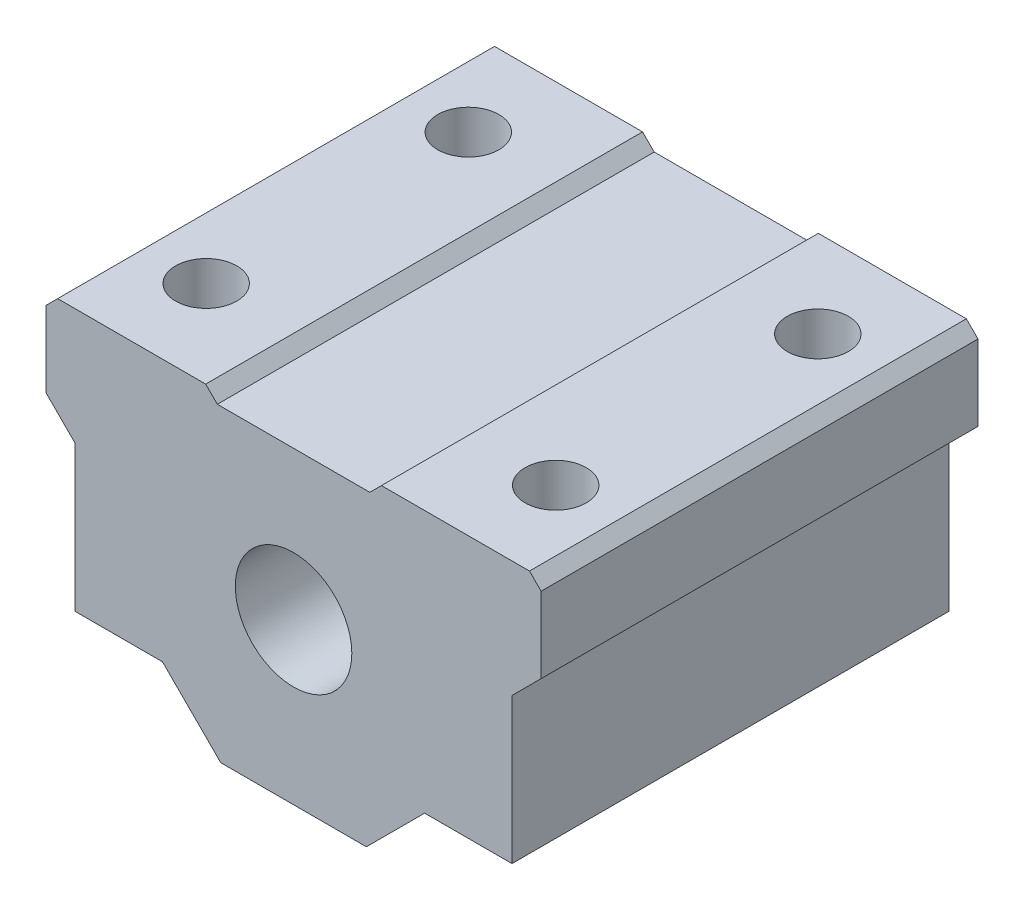
ISO-10303-21;
HEADER;
FILE_DESCRIPTION(('STEP AP214'),'2;1');
FILE_NAME('part.step','',(''),(''),'','','');
FILE_SCHEMA(('AUTOMOTIVE_DESIGN { 1 0 10303 214 1 1 1 1 }'));
ENDSEC;
DATA;
#1=APPLICATION_CONTEXT('core data for automotive mechanical design processes');
#2=APPLICATION_PROTOCOL_DEFINITION('international standard','automotive_design',2000,#1);
#3=PRODUCT_CONTEXT('',#1,'mechanical');
#4=PRODUCT('Part','Part','',(#3));
#5=PRODUCT_RELATED_PRODUCT_CATEGORY('part','',(#4));
#6=PRODUCT_DEFINITION_FORMATION('','',#4);
#7=PRODUCT_DEFINITION_CONTEXT('part definition',#1,'design');
#8=PRODUCT_DEFINITION('design','',#6,#7);
#9=PRODUCT_DEFINITION_SHAPE('','',#8);
#10=(LENGTH_UNIT() NAMED_UNIT(*) SI_UNIT(.MILLI.,.METRE.));
#11=(NAMED_UNIT(*) PLANE_ANGLE_UNIT() SI_UNIT($,.RADIAN.));
#12=(NAMED_UNIT(*) SI_UNIT($,.STERADIAN.) SOLID_ANGLE_UNIT());
#13=UNCERTAINTY_MEASURE_WITH_UNIT(LENGTH_MEASURE(1.E-05),#10,'distance_accuracy_value','');
#14=(GEOMETRIC_REPRESENTATION_CONTEXT(3) GLOBAL_UNCERTAINTY_ASSIGNED_CONTEXT((#13)) GLOBAL_UNIT_ASSIGNED_CONTEXT((#10,
#11,#12)) REPRESENTATION_CONTEXT('',''));
#15=CARTESIAN_POINT('',(0.,0.,0.));
#16=DIRECTION('',(0.,0.,1.));
#17=DIRECTION('',(1.,0.,0.));
#18=AXIS2_PLACEMENT_3D('',#15,#16,#17);
#19=CARTESIAN_POINT('',(0.,0.,30.));
#20=DIRECTION('',(0.,0.,-1.));
#21=DIRECTION('',(-1.,0.,0.));
#22=AXIS2_PLACEMENT_3D('',#19,#20,#21);
#23=PLANE('',#22);
#24=DIRECTION('',(0.707106781186546,-0.707106781186549,0.));
#25=VECTOR('',#24,1.);
#26=CARTESIAN_POINT('',(-5.,-11.,30.));
#27=LINE('',#26,#25);
#28=CARTESIAN_POINT('',(-8.99999999999998,-7.,30.));
#29=VERTEX_POINT('',#28);
#30=CARTESIAN_POINT('',(-5.,-11.,30.));
#31=VERTEX_POINT('',#30);
#32=EDGE_CURVE('E229',#29,#31,#27,.T.);
#33=ORIENTED_EDGE('',*,*,#32,.T.);
#34=DIRECTION('',(1.,0.,0.));
#35=VECTOR('',#34,1.);
#36=CARTESIAN_POINT('',(5.,-11.,30.));
#37=LINE('',#36,#35);
#38=CARTESIAN_POINT('',(5.,-11.,30.));
#39=VERTEX_POINT('',#38);
#40=EDGE_CURVE('E127',#31,#39,#37,.T.);
#41=ORIENTED_EDGE('',*,*,#40,.T.);
#42=DIRECTION('',(0.707106781186546,0.707106781186549,0.));
#43=VECTOR('',#42,1.);
#44=CARTESIAN_POINT('',(5.,-11.,30.));
#45=LINE('',#44,#43);
#46=CARTESIAN_POINT('',(8.99999999999999,-7.,30.));
#47=VERTEX_POINT('',#46);
#48=EDGE_CURVE('E299',#39,#47,#45,.T.);
#49=ORIENTED_EDGE('',*,*,#48,.T.);
#50=DIRECTION('',(1.,0.,0.));
#51=VECTOR('',#50,1.);
#52=CARTESIAN_POINT('',(8.99999999999999,-7.,30.));
#53=LINE('',#52,#51);
#54=CARTESIAN_POINT('',(15.,-7.,30.));
#55=VERTEX_POINT('',#54);
#56=EDGE_CURVE('E301',#47,#55,#53,.T.);
#57=ORIENTED_EDGE('',*,*,#56,.T.);
#58=DIRECTION('',(0.,1.,0.));
#59=VECTOR('',#58,1.);
#60=CARTESIAN_POINT('',(15.,-7.,30.));
#61=LINE('',#60,#59);
#62=CARTESIAN_POINT('',(15.,3.00000000000001,30.));
#63=VERTEX_POINT('',#62);
#64=EDGE_CURVE('E303',#55,#63,#61,.T.);
#65=ORIENTED_EDGE('',*,*,#64,.T.);
#66=DIRECTION('',(0.707106781186548,0.707106781186547,0.));
#67=VECTOR('',#66,1.);
#68=CARTESIAN_POINT('',(15.,3.00000000000001,30.));
#69=LINE('',#68,#67);
#70=CARTESIAN_POINT('',(17.,5.,30.));
#71=VERTEX_POINT('',#70);
#72=EDGE_CURVE('E305',#63,#71,#69,.T.);
#73=ORIENTED_EDGE('',*,*,#72,.T.);
#74=DIRECTION('',(0.,1.,0.));
#75=VECTOR('',#74,1.);
#76=CARTESIAN_POINT('',(17.,5.,30.));
#77=LINE('',#76,#75);
#78=CARTESIAN_POINT('',(17.,10.2,30.));
#79=VERTEX_POINT('',#78);
#80=EDGE_CURVE('E307',#71,#79,#77,.T.);
#81=ORIENTED_EDGE('',*,*,#80,.T.);
#82=DIRECTION('',(-0.707106781186545,0.70710678118655,0.));
#83=VECTOR('',#82,1.);
#84=CARTESIAN_POINT('',(17.,10.2,30.));
#85=LINE('',#84,#83);
#86=CARTESIAN_POINT('',(16.2,11.,30.));
#87=VERTEX_POINT('',#86);
#88=EDGE_CURVE('E309',#79,#87,#85,.T.);
#89=ORIENTED_EDGE('',*,*,#88,.T.);
#90=DIRECTION('',(-1.,0.,0.));
#91=VECTOR('',#90,1.);
#92=CARTESIAN_POINT('',(16.2,11.,30.));
#93=LINE('',#92,#91);
#94=CARTESIAN_POINT('',(6.03499910675989,11.,30.));
#95=VERTEX_POINT('',#94);
#96=EDGE_CURVE('E311',#87,#95,#93,.T.);
#97=ORIENTED_EDGE('',*,*,#96,.T.);
#98=DIRECTION('',(-0.707106781186546,-0.707106781186549,0.));
#99=VECTOR('',#98,1.);
#100=CARTESIAN_POINT('',(6.03499910675989,11.,30.));
#101=LINE('',#100,#99);
#102=CARTESIAN_POINT('',(5.23499910675989,10.2,30.));
#103=VERTEX_POINT('',#102);
#104=EDGE_CURVE('E313',#95,#103,#101,.T.);
#105=ORIENTED_EDGE('',*,*,#104,.T.);
#106=DIRECTION('',(-1.,0.,0.));
#107=VECTOR('',#106,1.);
#108=CARTESIAN_POINT('',(-5.23499910675989,10.2,30.));
#109=LINE('',#108,#107);
#110=CARTESIAN_POINT('',(-5.23499910675989,10.2,30.));
#111=VERTEX_POINT('',#110);
#112=EDGE_CURVE('E315',#103,#111,#109,.T.);
#113=ORIENTED_EDGE('',*,*,#112,.T.);
#114=DIRECTION('',(-0.707106781186546,0.707106781186549,0.));
#115=VECTOR('',#114,1.);
#116=CARTESIAN_POINT('',(-6.03499910675989,11.,30.));
#117=LINE('',#116,#115);
#118=CARTESIAN_POINT('',(-6.03499910675989,11.,30.));
#119=VERTEX_POINT('',#118);
#120=EDGE_CURVE('E317',#111,#119,#117,.T.);
#121=ORIENTED_EDGE('',*,*,#120,.T.);
#122=DIRECTION('',(-1.,0.,0.));
#123=VECTOR('',#122,1.);
#124=CARTESIAN_POINT('',(-16.2,11.,30.));
#125=LINE('',#124,#123);
#126=CARTESIAN_POINT('',(-16.2,11.,30.));
#127=VERTEX_POINT('',#126);
#128=EDGE_CURVE('E319',#119,#127,#125,.T.);
#129=ORIENTED_EDGE('',*,*,#128,.T.);
#130=DIRECTION('',(-0.707106781186547,-0.707106781186548,0.));
#131=VECTOR('',#130,1.);
#132=CARTESIAN_POINT('',(-17.,10.2,30.));
#133=LINE('',#132,#131);
#134=CARTESIAN_POINT('',(-17.,10.2,30.));
#135=VERTEX_POINT('',#134);
#136=EDGE_CURVE('E321',#127,#135,#133,.T.);
#137=ORIENTED_EDGE('',*,*,#136,.T.);
#138=DIRECTION('',(0.,-1.,0.));
#139=VECTOR('',#138,1.);
#140=CARTESIAN_POINT('',(-17.,5.,30.));
#141=LINE('',#140,#139);
#142=CARTESIAN_POINT('',(-17.,5.,30.));
#143=VERTEX_POINT('',#142);
#144=EDGE_CURVE('E176',#135,#143,#141,.T.);
#145=ORIENTED_EDGE('',*,*,#144,.T.);
#146=DIRECTION('',(0.707106781186549,-0.707106781186546,0.));
#147=VECTOR('',#146,1.);
#148=CARTESIAN_POINT('',(-15.,3.00000000000001,30.));
#149=LINE('',#148,#147);
#150=CARTESIAN_POINT('',(-15.,3.00000000000001,30.));
#151=VERTEX_POINT('',#150);
#152=EDGE_CURVE('E170',#143,#151,#149,.T.);
#153=ORIENTED_EDGE('',*,*,#152,.T.);
#154=DIRECTION('',(0.,-1.,0.));
#155=VECTOR('',#154,1.);
#156=CARTESIAN_POINT('',(-15.,-7.,30.));
#157=LINE('',#156,#155);
#158=CARTESIAN_POINT('',(-15.,-7.,30.));
#159=VERTEX_POINT('',#158);
#160=EDGE_CURVE('E174',#151,#159,#157,.T.);
#161=ORIENTED_EDGE('',*,*,#160,.T.);
#162=DIRECTION('',(1.,0.,0.));
#163=VECTOR('',#162,1.);
#164=CARTESIAN_POINT('',(-8.99999999999998,-7.,30.));
#165=LINE('',#164,#163);
#166=EDGE_CURVE('E54',#159,#29,#165,.T.);
#167=ORIENTED_EDGE('',*,*,#166,.T.);
#168=EDGE_LOOP('',(#33,#41,#49,#57,#65,#73,#81,#89,#97,#105,#113,#121,#129,#137,#145,#153,#161,#167));
#169=FACE_BOUND('',#168,.T.);
#170=CARTESIAN_POINT('',(0.,0.,30.));
#171=DIRECTION('',(0.,0.,1.));
#172=DIRECTION('',(1.,0.,0.));
#173=AXIS2_PLACEMENT_3D('',#170,#171,#172);
#174=CIRCLE('',#173,4.);
#175=CARTESIAN_POINT('',(4.,0.,30.));
#176=VERTEX_POINT('',#175);
#177=EDGE_CURVE('E198',#176,#176,#174,.T.);
#178=ORIENTED_EDGE('',*,*,#177,.F.);
#179=EDGE_LOOP('',(#178));
#180=FACE_BOUND('',#179,.T.);
#181=ADVANCED_FACE('F35',(#169,#180),#23,.F.);
#182=CARTESIAN_POINT('',(0.,0.,0.));
#183=DIRECTION('',(0.,0.,-1.));
#184=DIRECTION('',(-1.,0.,0.));
#185=AXIS2_PLACEMENT_3D('',#182,#183,#184);
#186=PLANE('',#185);
#187=DIRECTION('',(0.707106781186546,-0.707106781186549,0.));
#188=VECTOR('',#187,1.);
#189=CARTESIAN_POINT('',(-5.,-11.,0.));
#190=LINE('',#189,#188);
#191=CARTESIAN_POINT('',(-8.99999999999998,-7.,0.));
#192=VERTEX_POINT('',#191);
#193=CARTESIAN_POINT('',(-5.,-11.,0.));
#194=VERTEX_POINT('',#193);
#195=EDGE_CURVE('E194',#192,#194,#190,.T.);
#196=ORIENTED_EDGE('',*,*,#195,.F.);
#197=DIRECTION('',(1.,0.,0.));
#198=VECTOR('',#197,1.);
#199=CARTESIAN_POINT('',(-8.99999999999998,-7.,0.));
#200=LINE('',#199,#198);
#201=CARTESIAN_POINT('',(-15.,-7.,0.));
#202=VERTEX_POINT('',#201);
#203=EDGE_CURVE('E119',#202,#192,#200,.T.);
#204=ORIENTED_EDGE('',*,*,#203,.F.);
#205=DIRECTION('',(0.,-1.,0.));
#206=VECTOR('',#205,1.);
#207=CARTESIAN_POINT('',(-15.,-7.,0.));
#208=LINE('',#207,#206);
#209=CARTESIAN_POINT('',(-15.,3.00000000000001,0.));
#210=VERTEX_POINT('',#209);
#211=EDGE_CURVE('E113',#210,#202,#208,.T.);
#212=ORIENTED_EDGE('',*,*,#211,.F.);
#213=DIRECTION('',(0.707106781186549,-0.707106781186546,0.));
#214=VECTOR('',#213,1.);
#215=CARTESIAN_POINT('',(-15.,3.00000000000001,0.));
#216=LINE('',#215,#214);
#217=CARTESIAN_POINT('',(-17.,5.,0.));
#218=VERTEX_POINT('',#217);
#219=EDGE_CURVE('E184',#218,#210,#216,.T.);
#220=ORIENTED_EDGE('',*,*,#219,.F.);
#221=DIRECTION('',(0.,-1.,0.));
#222=VECTOR('',#221,1.);
#223=CARTESIAN_POINT('',(-17.,5.,0.));
#224=LINE('',#223,#222);
#225=CARTESIAN_POINT('',(-17.,10.2,0.));
#226=VERTEX_POINT('',#225);
#227=EDGE_CURVE('E224',#226,#218,#224,.T.);
#228=ORIENTED_EDGE('',*,*,#227,.F.);
#229=DIRECTION('',(-0.707106781186547,-0.707106781186548,0.));
#230=VECTOR('',#229,1.);
#231=CARTESIAN_POINT('',(-17.,10.2,0.));
#232=LINE('',#231,#230);
#233=CARTESIAN_POINT('',(-16.2,11.,0.));
#234=VERTEX_POINT('',#233);
#235=EDGE_CURVE('E222',#234,#226,#232,.T.);
#236=ORIENTED_EDGE('',*,*,#235,.F.);
#237=DIRECTION('',(-1.,0.,0.));
#238=VECTOR('',#237,1.);
#239=CARTESIAN_POINT('',(-16.2,11.,0.));
#240=LINE('',#239,#238);
#241=CARTESIAN_POINT('',(-6.03499910675989,11.,0.));
#242=VERTEX_POINT('',#241);
#243=EDGE_CURVE('E220',#242,#234,#240,.T.);
#244=ORIENTED_EDGE('',*,*,#243,.F.);
#245=DIRECTION('',(-0.707106781186546,0.707106781186549,0.));
#246=VECTOR('',#245,1.);
#247=CARTESIAN_POINT('',(-6.03499910675989,11.,0.));
#248=LINE('',#247,#246);
#249=CARTESIAN_POINT('',(-5.23499910675989,10.2,0.));
#250=VERTEX_POINT('',#249);
#251=EDGE_CURVE('E218',#250,#242,#248,.T.);
#252=ORIENTED_EDGE('',*,*,#251,.F.);
#253=DIRECTION('',(-1.,0.,0.));
#254=VECTOR('',#253,1.);
#255=CARTESIAN_POINT('',(-5.23499910675989,10.2,0.));
#256=LINE('',#255,#254);
#257=CARTESIAN_POINT('',(5.23499910675989,10.2,0.));
#258=VERTEX_POINT('',#257);
#259=EDGE_CURVE('E216',#258,#250,#256,.T.);
#260=ORIENTED_EDGE('',*,*,#259,.F.);
#261=DIRECTION('',(-0.707106781186546,-0.707106781186549,0.));
#262=VECTOR('',#261,1.);
#263=CARTESIAN_POINT('',(6.03499910675989,11.,0.));
#264=LINE('',#263,#262);
#265=CARTESIAN_POINT('',(6.03499910675989,11.,0.));
#266=VERTEX_POINT('',#265);
#267=EDGE_CURVE('E214',#266,#258,#264,.T.);
#268=ORIENTED_EDGE('',*,*,#267,.F.);
#269=DIRECTION('',(-1.,0.,0.));
#270=VECTOR('',#269,1.);
#271=CARTESIAN_POINT('',(16.2,11.,0.));
#272=LINE('',#271,#270);
#273=CARTESIAN_POINT('',(16.2,11.,0.));
#274=VERTEX_POINT('',#273);
#275=EDGE_CURVE('E212',#274,#266,#272,.T.);
#276=ORIENTED_EDGE('',*,*,#275,.F.);
#277=DIRECTION('',(-0.707106781186545,0.70710678118655,0.));
#278=VECTOR('',#277,1.);
#279=CARTESIAN_POINT('',(17.,10.2,0.));
#280=LINE('',#279,#278);
#281=CARTESIAN_POINT('',(17.,10.2,0.));
#282=VERTEX_POINT('',#281);
#283=EDGE_CURVE('E210',#282,#274,#280,.T.);
#284=ORIENTED_EDGE('',*,*,#283,.F.);
#285=DIRECTION('',(0.,1.,0.));
#286=VECTOR('',#285,1.);
#287=CARTESIAN_POINT('',(17.,5.,0.));
#288=LINE('',#287,#286);
#289=CARTESIAN_POINT('',(17.,5.,0.));
#290=VERTEX_POINT('',#289);
#291=EDGE_CURVE('E208',#290,#282,#288,.T.);
#292=ORIENTED_EDGE('',*,*,#291,.F.);
#293=DIRECTION('',(0.707106781186548,0.707106781186547,0.));
#294=VECTOR('',#293,1.);
#295=CARTESIAN_POINT('',(15.,3.00000000000001,0.));
#296=LINE('',#295,#294);
#297=CARTESIAN_POINT('',(15.,3.00000000000001,0.));
#298=VERTEX_POINT('',#297);
#299=EDGE_CURVE('E206',#298,#290,#296,.T.);
#300=ORIENTED_EDGE('',*,*,#299,.F.);
#301=DIRECTION('',(0.,1.,0.));
#302=VECTOR('',#301,1.);
#303=CARTESIAN_POINT('',(15.,-7.,0.));
#304=LINE('',#303,#302);
#305=CARTESIAN_POINT('',(15.,-7.,0.));
#306=VERTEX_POINT('',#305);
#307=EDGE_CURVE('E204',#306,#298,#304,.T.);
#308=ORIENTED_EDGE('',*,*,#307,.F.);
#309=DIRECTION('',(1.,0.,0.));
#310=VECTOR('',#309,1.);
#311=CARTESIAN_POINT('',(8.99999999999999,-7.,0.));
#312=LINE('',#311,#310);
#313=CARTESIAN_POINT('',(8.99999999999999,-7.,0.));
#314=VERTEX_POINT('',#313);
#315=EDGE_CURVE('E202',#314,#306,#312,.T.);
#316=ORIENTED_EDGE('',*,*,#315,.F.);
#317=DIRECTION('',(0.707106781186546,0.707106781186549,0.));
#318=VECTOR('',#317,1.);
#319=CARTESIAN_POINT('',(5.,-11.,0.));
#320=LINE('',#319,#318);
#321=CARTESIAN_POINT('',(5.,-11.,0.));
#322=VERTEX_POINT('',#321);
#323=EDGE_CURVE('E200',#322,#314,#320,.T.);
#324=ORIENTED_EDGE('',*,*,#323,.F.);
#325=DIRECTION('',(1.,0.,0.));
#326=VECTOR('',#325,1.);
#327=CARTESIAN_POINT('',(5.,-11.,0.));
#328=LINE('',#327,#326);
#329=EDGE_CURVE('E197',#194,#322,#328,.T.);
#330=ORIENTED_EDGE('',*,*,#329,.F.);
#331=EDGE_LOOP('',(#196,#204,#212,#220,#228,#236,#244,#252,#260,#268,#276,#284,#292,#300,#308,
#316,#324,#330));
#332=FACE_BOUND('',#331,.T.);
#333=CARTESIAN_POINT('',(0.,0.,0.));
#334=DIRECTION('',(0.,0.,1.));
#335=DIRECTION('',(1.,0.,0.));
#336=AXIS2_PLACEMENT_3D('',#333,#334,#335);
#337=CIRCLE('',#336,4.);
#338=CARTESIAN_POINT('',(4.,0.,0.));
#339=VERTEX_POINT('',#338);
#340=EDGE_CURVE('E292',#339,#339,#337,.T.);
#341=ORIENTED_EDGE('',*,*,#340,.T.);
#342=EDGE_LOOP('',(#341));
#343=FACE_BOUND('',#342,.T.);
#344=ADVANCED_FACE('F334',(#332,#343),#186,.T.);
#345=CARTESIAN_POINT('',(-5.,-11.,30.));
#346=DIRECTION('',(0.707106781186549,0.707106781186546,0.));
#347=DIRECTION('',(-0.707106781186546,0.707106781186549,0.));
#348=AXIS2_PLACEMENT_3D('',#345,#346,#347);
#349=PLANE('',#348);
#350=ORIENTED_EDGE('',*,*,#195,.T.);
#351=DIRECTION('',(0.,0.,-1.));
#352=VECTOR('',#351,1.);
#353=CARTESIAN_POINT('',(-5.,-11.,30.));
#354=LINE('',#353,#352);
#355=EDGE_CURVE('E11',#31,#194,#354,.T.);
#356=ORIENTED_EDGE('',*,*,#355,.F.);
#357=ORIENTED_EDGE('',*,*,#32,.F.);
#358=DIRECTION('',(0.,0.,-1.));
#359=VECTOR('',#358,1.);
#360=CARTESIAN_POINT('',(-8.99999999999998,-7.,30.));
#361=LINE('',#360,#359);
#362=EDGE_CURVE('E190',#29,#192,#361,.T.);
#363=ORIENTED_EDGE('',*,*,#362,.T.);
#364=EDGE_LOOP('',(#350,#356,#357,#363));
#365=FACE_BOUND('',#364,.T.);
#366=ADVANCED_FACE('F37',(#365),#349,.F.);
#367=CARTESIAN_POINT('',(5.,-11.,30.));
#368=DIRECTION('',(0.,1.,0.));
#369=DIRECTION('',(-1.,0.,0.));
#370=AXIS2_PLACEMENT_3D('',#367,#368,#369);
#371=PLANE('',#370);
#372=ORIENTED_EDGE('',*,*,#329,.T.);
#373=DIRECTION('',(0.,0.,-1.));
#374=VECTOR('',#373,1.);
#375=CARTESIAN_POINT('',(5.,-11.,30.));
#376=LINE('',#375,#374);
#377=EDGE_CURVE('E45',#39,#322,#376,.T.);
#378=ORIENTED_EDGE('',*,*,#377,.F.);
#379=ORIENTED_EDGE('',*,*,#40,.F.);
#380=ORIENTED_EDGE('',*,*,#355,.T.);
#381=EDGE_LOOP('',(#372,#378,#379,#380));
#382=FACE_BOUND('',#381,.T.);
#383=ADVANCED_FACE('F411',(#382),#371,.F.);
#384=CARTESIAN_POINT('',(5.,-11.,30.));
#385=DIRECTION('',(-0.707106781186549,0.707106781186546,0.));
#386=DIRECTION('',(-0.707106781186546,-0.707106781186549,0.));
#387=AXIS2_PLACEMENT_3D('',#384,#385,#386);
#388=PLANE('',#387);
#389=ORIENTED_EDGE('',*,*,#323,.T.);
#390=DIRECTION('',(0.,0.,-1.));
#391=VECTOR('',#390,1.);
#392=CARTESIAN_POINT('',(8.99999999999999,-7.,30.));
#393=LINE('',#392,#391);
#394=EDGE_CURVE('E266',#47,#314,#393,.T.);
#395=ORIENTED_EDGE('',*,*,#394,.F.);
#396=ORIENTED_EDGE('',*,*,#48,.F.);
#397=ORIENTED_EDGE('',*,*,#377,.T.);
#398=EDGE_LOOP('',(#389,#395,#396,#397));
#399=FACE_BOUND('',#398,.T.);
#400=ADVANCED_FACE('F385',(#399),#388,.F.);
#401=CARTESIAN_POINT('',(8.99999999999999,-7.,30.));
#402=DIRECTION('',(0.,1.,0.));
#403=DIRECTION('',(-1.,0.,0.));
#404=AXIS2_PLACEMENT_3D('',#401,#402,#403);
#405=PLANE('',#404);
#406=CARTESIAN_POINT('',(12.,-7.,6.));
#407=DIRECTION('',(0.,1.,0.));
#408=DIRECTION('',(-1.,0.,0.));
#409=AXIS2_PLACEMENT_3D('',#406,#407,#408);
#410=CIRCLE('',#409,2.1);
#411=CARTESIAN_POINT('',(9.9,-7.,6.));
#412=VERTEX_POINT('',#411);
#413=EDGE_CURVE('E289',#412,#412,#410,.T.);
#414=ORIENTED_EDGE('',*,*,#413,.T.);
#415=EDGE_LOOP('',(#414));
#416=FACE_BOUND('',#415,.T.);
#417=CARTESIAN_POINT('',(12.,-7.,24.));
#418=DIRECTION('',(0.,1.,0.));
#419=DIRECTION('',(-1.,0.,0.));
#420=AXIS2_PLACEMENT_3D('',#417,#418,#419);
#421=CIRCLE('',#420,2.1);
#422=CARTESIAN_POINT('',(9.9,-7.,24.));
#423=VERTEX_POINT('',#422);
#424=EDGE_CURVE('E276',#423,#423,#421,.T.);
#425=ORIENTED_EDGE('',*,*,#424,.T.);
#426=EDGE_LOOP('',(#425));
#427=FACE_BOUND('',#426,.T.);
#428=ORIENTED_EDGE('',*,*,#315,.T.);
#429=DIRECTION('',(0.,0.,-1.));
#430=VECTOR('',#429,1.);
#431=CARTESIAN_POINT('',(15.,-7.,30.));
#432=LINE('',#431,#430);
#433=EDGE_CURVE('E263',#55,#306,#432,.T.);
#434=ORIENTED_EDGE('',*,*,#433,.F.);
#435=ORIENTED_EDGE('',*,*,#56,.F.);
#436=ORIENTED_EDGE('',*,*,#394,.T.);
#437=EDGE_LOOP('',(#428,#434,#435,#436));
#438=FACE_BOUND('',#437,.T.);
#439=ADVANCED_FACE('F381',(#416,#427,#438),#405,.F.);
#440=CARTESIAN_POINT('',(15.,-7.,30.));
#441=DIRECTION('',(-1.,0.,0.));
#442=DIRECTION('',(0.,-1.,0.));
#443=AXIS2_PLACEMENT_3D('',#440,#441,#442);
#444=PLANE('',#443);
#445=ORIENTED_EDGE('',*,*,#307,.T.);
#446=DIRECTION('',(0.,0.,-1.));
#447=VECTOR('',#446,1.);
#448=CARTESIAN_POINT('',(15.,3.00000000000001,30.));
#449=LINE('',#448,#447);
#450=EDGE_CURVE('E260',#63,#298,#449,.T.);
#451=ORIENTED_EDGE('',*,*,#450,.F.);
#452=ORIENTED_EDGE('',*,*,#64,.F.);
#453=ORIENTED_EDGE('',*,*,#433,.T.);
#454=EDGE_LOOP('',(#445,#451,#452,#453));
#455=FACE_BOUND('',#454,.T.);
#456=ADVANCED_FACE('F384',(#455),#444,.F.);
#457=CARTESIAN_POINT('',(15.,3.00000000000001,30.));
#458=DIRECTION('',(-0.707106781186547,0.707106781186548,0.));
#459=DIRECTION('',(-0.707106781186548,-0.707106781186547,0.));
#460=AXIS2_PLACEMENT_3D('',#457,#458,#459);
#461=PLANE('',#460);
#462=ORIENTED_EDGE('',*,*,#299,.T.);
#463=DIRECTION('',(0.,0.,-1.));
#464=VECTOR('',#463,1.);
#465=CARTESIAN_POINT('',(17.,5.,30.));
#466=LINE('',#465,#464);
#467=EDGE_CURVE('E257',#71,#290,#466,.T.);
#468=ORIENTED_EDGE('',*,*,#467,.F.);
#469=ORIENTED_EDGE('',*,*,#72,.F.);
#470=ORIENTED_EDGE('',*,*,#450,.T.);
#471=EDGE_LOOP('',(#462,#468,#469,#470));
#472=FACE_BOUND('',#471,.T.);
#473=ADVANCED_FACE('F401',(#472),#461,.F.);
#474=CARTESIAN_POINT('',(17.,5.,30.));
#475=DIRECTION('',(-1.,0.,0.));
#476=DIRECTION('',(0.,0.,1.));
#477=AXIS2_PLACEMENT_3D('',#474,#475,#476);
#478=PLANE('',#477);
#479=ORIENTED_EDGE('',*,*,#291,.T.);
#480=DIRECTION('',(0.,0.,-1.));
#481=VECTOR('',#480,1.);
#482=CARTESIAN_POINT('',(17.,10.2,30.));
#483=LINE('',#482,#481);
#484=EDGE_CURVE('E254',#79,#282,#483,.T.);
#485=ORIENTED_EDGE('',*,*,#484,.F.);
#486=ORIENTED_EDGE('',*,*,#80,.F.);
#487=ORIENTED_EDGE('',*,*,#467,.T.);
#488=EDGE_LOOP('',(#479,#485,#486,#487));
#489=FACE_BOUND('',#488,.T.);
#490=ADVANCED_FACE('F405',(#489),#478,.F.);
#491=CARTESIAN_POINT('',(17.,10.2,30.));
#492=DIRECTION('',(-0.70710678118655,-0.707106781186545,0.));
#493=DIRECTION('',(0.707106781186545,-0.70710678118655,0.));
#494=AXIS2_PLACEMENT_3D('',#491,#492,#493);
#495=PLANE('',#494);
#496=ORIENTED_EDGE('',*,*,#283,.T.);
#497=DIRECTION('',(0.,0.,-1.));
#498=VECTOR('',#497,1.);
#499=CARTESIAN_POINT('',(16.2,11.,30.));
#500=LINE('',#499,#498);
#501=EDGE_CURVE('E251',#87,#274,#500,.T.);
#502=ORIENTED_EDGE('',*,*,#501,.F.);
#503=ORIENTED_EDGE('',*,*,#88,.F.);
#504=ORIENTED_EDGE('',*,*,#484,.T.);
#505=EDGE_LOOP('',(#496,#502,#503,#504));
#506=FACE_BOUND('',#505,.T.);
#507=ADVANCED_FACE('F425',(#506),#495,.F.);
#508=CARTESIAN_POINT('',(16.2,11.,30.));
#509=DIRECTION('',(0.,-1.,0.));
#510=DIRECTION('',(1.,0.,0.));
#511=AXIS2_PLACEMENT_3D('',#508,#509,#510);
#512=PLANE('',#511);
#513=CARTESIAN_POINT('',(12.,11.,6.));
#514=DIRECTION('',(0.,1.,0.));
#515=DIRECTION('',(0.,0.,-1.));
#516=AXIS2_PLACEMENT_3D('',#513,#514,#515);
#517=CIRCLE('',#516,2.1);
#518=CARTESIAN_POINT('',(12.,11.,3.9));
#519=VERTEX_POINT('',#518);
#520=EDGE_CURVE('E283',#519,#519,#517,.T.);
#521=ORIENTED_EDGE('',*,*,#520,.F.);
#522=EDGE_LOOP('',(#521));
#523=FACE_BOUND('',#522,.T.);
#524=CARTESIAN_POINT('',(12.,11.,24.));
#525=DIRECTION('',(0.,1.,0.));
#526=DIRECTION('',(0.,0.,-1.));
#527=AXIS2_PLACEMENT_3D('',#524,#525,#526);
#528=CIRCLE('',#527,2.1);
#529=CARTESIAN_POINT('',(12.,11.,21.9));
#530=VERTEX_POINT('',#529);
#531=EDGE_CURVE('E378',#530,#530,#528,.T.);
#532=ORIENTED_EDGE('',*,*,#531,.F.);
#533=EDGE_LOOP('',(#532));
#534=FACE_BOUND('',#533,.T.);
#535=ORIENTED_EDGE('',*,*,#275,.T.);
#536=DIRECTION('',(0.,0.,-1.));
#537=VECTOR('',#536,1.);
#538=CARTESIAN_POINT('',(6.03499910675989,11.,30.));
#539=LINE('',#538,#537);
#540=EDGE_CURVE('E248',#95,#266,#539,.T.);
#541=ORIENTED_EDGE('',*,*,#540,.F.);
#542=ORIENTED_EDGE('',*,*,#96,.F.);
#543=ORIENTED_EDGE('',*,*,#501,.T.);
#544=EDGE_LOOP('',(#535,#541,#542,#543));
#545=FACE_BOUND('',#544,.T.);
#546=ADVANCED_FACE('F428',(#523,#534,#545),#512,.F.);
#547=CARTESIAN_POINT('',(6.03499910675989,11.,30.));
#548=DIRECTION('',(0.707106781186549,-0.707106781186546,0.));
#549=DIRECTION('',(0.707106781186546,0.707106781186549,0.));
#550=AXIS2_PLACEMENT_3D('',#547,#548,#549);
#551=PLANE('',#550);
#552=ORIENTED_EDGE('',*,*,#267,.T.);
#553=DIRECTION('',(0.,0.,-1.));
#554=VECTOR('',#553,1.);
#555=CARTESIAN_POINT('',(5.23499910675989,10.2,30.));
#556=LINE('',#555,#554);
#557=EDGE_CURVE('E245',#103,#258,#556,.T.);
#558=ORIENTED_EDGE('',*,*,#557,.F.);
#559=ORIENTED_EDGE('',*,*,#104,.F.);
#560=ORIENTED_EDGE('',*,*,#540,.T.);
#561=EDGE_LOOP('',(#552,#558,#559,#560));
#562=FACE_BOUND('',#561,.T.);
#563=ADVANCED_FACE('F432',(#562),#551,.F.);
#564=CARTESIAN_POINT('',(-5.23499910675989,10.2,30.));
#565=DIRECTION('',(0.,-1.,0.));
#566=DIRECTION('',(1.,0.,0.));
#567=AXIS2_PLACEMENT_3D('',#564,#565,#566);
#568=PLANE('',#567);
#569=ORIENTED_EDGE('',*,*,#259,.T.);
#570=DIRECTION('',(0.,0.,-1.));
#571=VECTOR('',#570,1.);
#572=CARTESIAN_POINT('',(-5.23499910675989,10.2,30.));
#573=LINE('',#572,#571);
#574=EDGE_CURVE('E242',#111,#250,#573,.T.);
#575=ORIENTED_EDGE('',*,*,#574,.F.);
#576=ORIENTED_EDGE('',*,*,#112,.F.);
#577=ORIENTED_EDGE('',*,*,#557,.T.);
#578=EDGE_LOOP('',(#569,#575,#576,#577));
#579=FACE_BOUND('',#578,.T.);
#580=ADVANCED_FACE('F436',(#579),#568,.F.);
#581=CARTESIAN_POINT('',(-6.03499910675989,11.,30.));
#582=DIRECTION('',(-0.707106781186549,-0.707106781186546,0.));
#583=DIRECTION('',(0.707106781186546,-0.707106781186549,0.));
#584=AXIS2_PLACEMENT_3D('',#581,#582,#583);
#585=PLANE('',#584);
#586=ORIENTED_EDGE('',*,*,#251,.T.);
#587=DIRECTION('',(0.,0.,-1.));
#588=VECTOR('',#587,1.);
#589=CARTESIAN_POINT('',(-6.03499910675989,11.,30.));
#590=LINE('',#589,#588);
#591=EDGE_CURVE('E239',#119,#242,#590,.T.);
#592=ORIENTED_EDGE('',*,*,#591,.F.);
#593=ORIENTED_EDGE('',*,*,#120,.F.);
#594=ORIENTED_EDGE('',*,*,#574,.T.);
#595=EDGE_LOOP('',(#586,#592,#593,#594));
#596=FACE_BOUND('',#595,.T.);
#597=ADVANCED_FACE('F440',(#596),#585,.F.);
#598=CARTESIAN_POINT('',(-16.2,11.,30.));
#599=DIRECTION('',(0.,-1.,0.));
#600=DIRECTION('',(0.,0.,-1.));
#601=AXIS2_PLACEMENT_3D('',#598,#599,#600);
#602=PLANE('',#601);
#603=CARTESIAN_POINT('',(-12.,11.,24.));
#604=DIRECTION('',(0.,1.,0.));
#605=DIRECTION('',(0.,0.,1.));
#606=AXIS2_PLACEMENT_3D('',#603,#604,#605);
#607=CIRCLE('',#606,2.1);
#608=CARTESIAN_POINT('',(-12.,11.,26.1));
#609=VERTEX_POINT('',#608);
#610=EDGE_CURVE('E278',#609,#609,#607,.T.);
#611=ORIENTED_EDGE('',*,*,#610,.F.);
#612=EDGE_LOOP('',(#611));
#613=FACE_BOUND('',#612,.T.);
#614=CARTESIAN_POINT('',(-12.,11.,6.));
#615=DIRECTION('',(0.,1.,0.));
#616=DIRECTION('',(0.,0.,1.));
#617=AXIS2_PLACEMENT_3D('',#614,#615,#616);
#618=CIRCLE('',#617,2.1);
#619=CARTESIAN_POINT('',(-12.,11.,8.1));
#620=VERTEX_POINT('',#619);
#621=EDGE_CURVE('E272',#620,#620,#618,.T.);
#622=ORIENTED_EDGE('',*,*,#621,.F.);
#623=EDGE_LOOP('',(#622));
#624=FACE_BOUND('',#623,.T.);
#625=ORIENTED_EDGE('',*,*,#243,.T.);
#626=DIRECTION('',(0.,0.,-1.));
#627=VECTOR('',#626,1.);
#628=CARTESIAN_POINT('',(-16.2,11.,30.));
#629=LINE('',#628,#627);
#630=EDGE_CURVE('E236',#127,#234,#629,.T.);
#631=ORIENTED_EDGE('',*,*,#630,.F.);
#632=ORIENTED_EDGE('',*,*,#128,.F.);
#633=ORIENTED_EDGE('',*,*,#591,.T.);
#634=EDGE_LOOP('',(#625,#631,#632,#633));
#635=FACE_BOUND('',#634,.T.);
#636=ADVANCED_FACE('F444',(#613,#624,#635),#602,.F.);
#637=CARTESIAN_POINT('',(-17.,10.2,30.));
#638=DIRECTION('',(0.707106781186548,-0.707106781186547,0.));
#639=DIRECTION('',(0.707106781186547,0.707106781186548,0.));
#640=AXIS2_PLACEMENT_3D('',#637,#638,#639);
#641=PLANE('',#640);
#642=ORIENTED_EDGE('',*,*,#235,.T.);
#643=DIRECTION('',(0.,0.,-1.));
#644=VECTOR('',#643,1.);
#645=CARTESIAN_POINT('',(-17.,10.2,30.));
#646=LINE('',#645,#644);
#647=EDGE_CURVE('E233',#135,#226,#646,.T.);
#648=ORIENTED_EDGE('',*,*,#647,.F.);
#649=ORIENTED_EDGE('',*,*,#136,.F.);
#650=ORIENTED_EDGE('',*,*,#630,.T.);
#651=EDGE_LOOP('',(#642,#648,#649,#650));
#652=FACE_BOUND('',#651,.T.);
#653=ADVANCED_FACE('F327',(#652),#641,.F.);
#654=CARTESIAN_POINT('',(-17.,5.,30.));
#655=DIRECTION('',(1.,0.,0.));
#656=DIRECTION('',(0.,0.,-1.));
#657=AXIS2_PLACEMENT_3D('',#654,#655,#656);
#658=PLANE('',#657);
#659=ORIENTED_EDGE('',*,*,#227,.T.);
#660=DIRECTION('',(0.,0.,-1.));
#661=VECTOR('',#660,1.);
#662=CARTESIAN_POINT('',(-17.,5.,30.));
#663=LINE('',#662,#661);
#664=EDGE_CURVE('E185',#143,#218,#663,.T.);
#665=ORIENTED_EDGE('',*,*,#664,.F.);
#666=ORIENTED_EDGE('',*,*,#144,.F.);
#667=ORIENTED_EDGE('',*,*,#647,.T.);
#668=EDGE_LOOP('',(#659,#665,#666,#667));
#669=FACE_BOUND('',#668,.T.);
#670=ADVANCED_FACE('F331',(#669),#658,.F.);
#671=CARTESIAN_POINT('',(-15.,3.00000000000001,30.));
#672=DIRECTION('',(0.707106781186546,0.707106781186549,0.));
#673=DIRECTION('',(-0.707106781186549,0.707106781186546,0.));
#674=AXIS2_PLACEMENT_3D('',#671,#672,#673);
#675=PLANE('',#674);
#676=ORIENTED_EDGE('',*,*,#219,.T.);
#677=DIRECTION('',(0.,0.,-1.));
#678=VECTOR('',#677,1.);
#679=CARTESIAN_POINT('',(-15.,3.00000000000001,30.));
#680=LINE('',#679,#678);
#681=EDGE_CURVE('E181',#151,#210,#680,.T.);
#682=ORIENTED_EDGE('',*,*,#681,.F.);
#683=ORIENTED_EDGE('',*,*,#152,.F.);
#684=ORIENTED_EDGE('',*,*,#664,.T.);
#685=EDGE_LOOP('',(#676,#682,#683,#684));
#686=FACE_BOUND('',#685,.T.);
#687=ADVANCED_FACE('F182',(#686),#675,.F.);
#688=CARTESIAN_POINT('',(-15.,-7.,30.));
#689=DIRECTION('',(1.,0.,0.));
#690=DIRECTION('',(0.,0.,-1.));
#691=AXIS2_PLACEMENT_3D('',#688,#689,#690);
#692=PLANE('',#691);
#693=ORIENTED_EDGE('',*,*,#211,.T.);
#694=DIRECTION('',(0.,0.,-1.));
#695=VECTOR('',#694,1.);
#696=CARTESIAN_POINT('',(-15.,-7.,30.));
#697=LINE('',#696,#695);
#698=EDGE_CURVE('E186',#159,#202,#697,.T.);
#699=ORIENTED_EDGE('',*,*,#698,.F.);
#700=ORIENTED_EDGE('',*,*,#160,.F.);
#701=ORIENTED_EDGE('',*,*,#681,.T.);
#702=EDGE_LOOP('',(#693,#699,#700,#701));
#703=FACE_BOUND('',#702,.T.);
#704=ADVANCED_FACE('F188',(#703),#692,.F.);
#705=CARTESIAN_POINT('',(-8.99999999999998,-7.,30.));
#706=DIRECTION('',(0.,1.,0.));
#707=DIRECTION('',(-1.,0.,0.));
#708=AXIS2_PLACEMENT_3D('',#705,#706,#707);
#709=PLANE('',#708);
#710=CARTESIAN_POINT('',(-12.,-7.,24.));
#711=DIRECTION('',(0.,1.,0.));
#712=DIRECTION('',(-1.,0.,0.));
#713=AXIS2_PLACEMENT_3D('',#710,#711,#712);
#714=CIRCLE('',#713,2.1);
#715=CARTESIAN_POINT('',(-14.1,-7.,24.));
#716=VERTEX_POINT('',#715);
#717=EDGE_CURVE('E39',#716,#716,#714,.T.);
#718=ORIENTED_EDGE('',*,*,#717,.T.);
#719=EDGE_LOOP('',(#718));
#720=FACE_BOUND('',#719,.T.);
#721=CARTESIAN_POINT('',(-12.,-7.,6.));
#722=DIRECTION('',(0.,1.,0.));
#723=DIRECTION('',(-1.,0.,0.));
#724=AXIS2_PLACEMENT_3D('',#721,#722,#723);
#725=CIRCLE('',#724,2.1);
#726=CARTESIAN_POINT('',(-14.1,-7.,6.));
#727=VERTEX_POINT('',#726);
#728=EDGE_CURVE('E270',#727,#727,#725,.T.);
#729=ORIENTED_EDGE('',*,*,#728,.T.);
#730=EDGE_LOOP('',(#729));
#731=FACE_BOUND('',#730,.T.);
#732=ORIENTED_EDGE('',*,*,#203,.T.);
#733=ORIENTED_EDGE('',*,*,#362,.F.);
#734=ORIENTED_EDGE('',*,*,#166,.F.);
#735=ORIENTED_EDGE('',*,*,#698,.T.);
#736=EDGE_LOOP('',(#732,#733,#734,#735));
#737=FACE_BOUND('',#736,.T.);
#738=ADVANCED_FACE('F340',(#720,#731,#737),#709,.F.);
#739=CARTESIAN_POINT('',(0.,0.,30.));
#740=DIRECTION('',(0.,0.,-1.));
#741=DIRECTION('',(-1.,0.,0.));
#742=AXIS2_PLACEMENT_3D('',#739,#740,#741);
#743=CYLINDRICAL_SURFACE('',#742,4.);
#744=ORIENTED_EDGE('',*,*,#177,.T.);
#745=EDGE_LOOP('',(#744));
#746=FACE_BOUND('',#745,.T.);
#747=ORIENTED_EDGE('',*,*,#340,.F.);
#748=EDGE_LOOP('',(#747));
#749=FACE_BOUND('',#748,.T.);
#750=ADVANCED_FACE('F342',(#746,#749),#743,.F.);
#751=CARTESIAN_POINT('',(-12.,-19.,6.));
#752=DIRECTION('',(0.,1.,0.));
#753=DIRECTION('',(0.,0.,1.));
#754=AXIS2_PLACEMENT_3D('',#751,#752,#753);
#755=CYLINDRICAL_SURFACE('',#754,2.1);
#756=ORIENTED_EDGE('',*,*,#621,.T.);
#757=EDGE_LOOP('',(#756));
#758=FACE_BOUND('',#757,.T.);
#759=ORIENTED_EDGE('',*,*,#728,.F.);
#760=EDGE_LOOP('',(#759));
#761=FACE_BOUND('',#760,.T.);
#762=ADVANCED_FACE('F349',(#758,#761),#755,.F.);
#763=CARTESIAN_POINT('',(-12.,-19.,24.));
#764=DIRECTION('',(0.,1.,0.));
#765=DIRECTION('',(0.,0.,1.));
#766=AXIS2_PLACEMENT_3D('',#763,#764,#765);
#767=CYLINDRICAL_SURFACE('',#766,2.1);
#768=ORIENTED_EDGE('',*,*,#610,.T.);
#769=EDGE_LOOP('',(#768));
#770=FACE_BOUND('',#769,.T.);
#771=ORIENTED_EDGE('',*,*,#717,.F.);
#772=EDGE_LOOP('',(#771));
#773=FACE_BOUND('',#772,.T.);
#774=ADVANCED_FACE('F362',(#770,#773),#767,.F.);
#775=CARTESIAN_POINT('',(12.,-19.,24.));
#776=DIRECTION('',(0.,1.,0.));
#777=DIRECTION('',(0.,0.,1.));
#778=AXIS2_PLACEMENT_3D('',#775,#776,#777);
#779=CYLINDRICAL_SURFACE('',#778,2.1);
#780=ORIENTED_EDGE('',*,*,#531,.T.);
#781=EDGE_LOOP('',(#780));
#782=FACE_BOUND('',#781,.T.);
#783=ORIENTED_EDGE('',*,*,#424,.F.);
#784=EDGE_LOOP('',(#783));
#785=FACE_BOUND('',#784,.T.);
#786=ADVANCED_FACE('F366',(#782,#785),#779,.F.);
#787=CARTESIAN_POINT('',(12.,-19.,6.));
#788=DIRECTION('',(0.,1.,0.));
#789=DIRECTION('',(0.,0.,1.));
#790=AXIS2_PLACEMENT_3D('',#787,#788,#789);
#791=CYLINDRICAL_SURFACE('',#790,2.1);
#792=ORIENTED_EDGE('',*,*,#520,.T.);
#793=EDGE_LOOP('',(#792));
#794=FACE_BOUND('',#793,.T.);
#795=ORIENTED_EDGE('',*,*,#413,.F.);
#796=EDGE_LOOP('',(#795));
#797=FACE_BOUND('',#796,.T.);
#798=ADVANCED_FACE('F363',(#794,#797),#791,.F.);
#799=CLOSED_SHELL('',(#181,#344,#366,#383,#400,#439,#456,#473,#490,#507,#546,#563,#580,#597,
#636,#653,#670,#687,#704,#738,#750,#762,#774,#786,#798));
#800=MANIFOLD_SOLID_BREP('B2',#799);
#801=ADVANCED_BREP_SHAPE_REPRESENTATION('',(#18,#800),#14);
#802=SHAPE_DEFINITION_REPRESENTATION(#9,#801);
ENDSEC;
END-ISO-10303-21;
